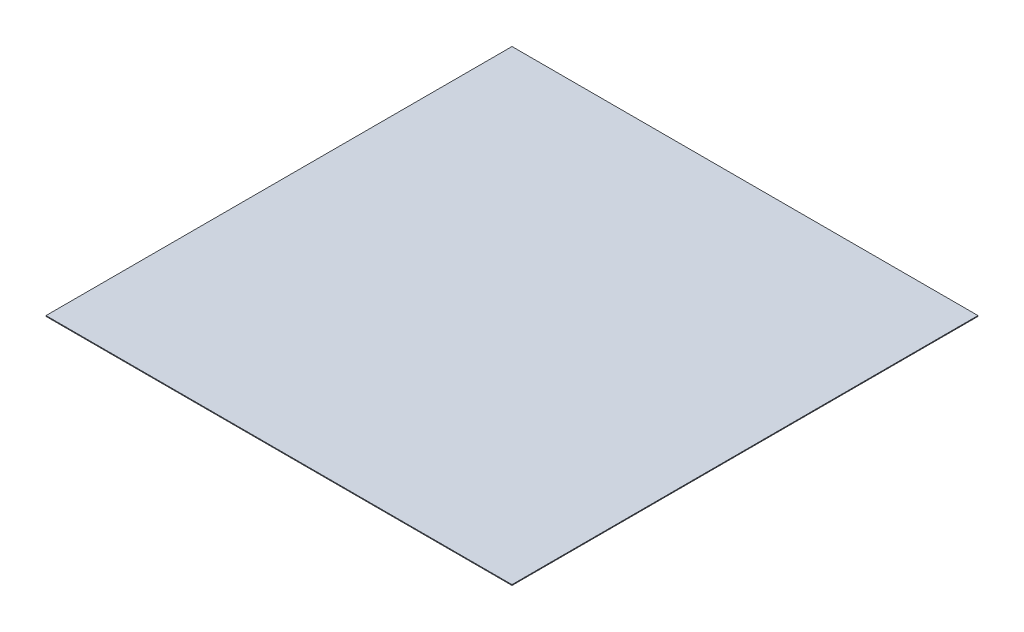
ISO-10303-21;
HEADER;
FILE_DESCRIPTION(('STEP AP214'),'2;1');
FILE_NAME('part.step','',(''),(''),'','','');
FILE_SCHEMA(('AUTOMOTIVE_DESIGN { 1 0 10303 214 1 1 1 1 }'));
ENDSEC;
DATA;
#1=APPLICATION_CONTEXT('core data for automotive mechanical design processes');
#2=APPLICATION_PROTOCOL_DEFINITION('international standard','automotive_design',2000,#1);
#3=PRODUCT_CONTEXT('',#1,'mechanical');
#4=PRODUCT('Part','Part','',(#3));
#5=PRODUCT_RELATED_PRODUCT_CATEGORY('part','',(#4));
#6=PRODUCT_DEFINITION_FORMATION('','',#4);
#7=PRODUCT_DEFINITION_CONTEXT('part definition',#1,'design');
#8=PRODUCT_DEFINITION('design','',#6,#7);
#9=PRODUCT_DEFINITION_SHAPE('','',#8);
#10=(LENGTH_UNIT() NAMED_UNIT(*) SI_UNIT(.MILLI.,.METRE.));
#11=(NAMED_UNIT(*) PLANE_ANGLE_UNIT() SI_UNIT($,.RADIAN.));
#12=(NAMED_UNIT(*) SI_UNIT($,.STERADIAN.) SOLID_ANGLE_UNIT());
#13=UNCERTAINTY_MEASURE_WITH_UNIT(LENGTH_MEASURE(1.E-05),#10,'distance_accuracy_value','');
#14=(GEOMETRIC_REPRESENTATION_CONTEXT(3) GLOBAL_UNCERTAINTY_ASSIGNED_CONTEXT((#13)) GLOBAL_UNIT_ASSIGNED_CONTEXT((#10,
#11,#12)) REPRESENTATION_CONTEXT('',''));
#15=CARTESIAN_POINT('',(0.,0.,0.));
#16=DIRECTION('',(0.,0.,1.));
#17=DIRECTION('',(1.,0.,0.));
#18=AXIS2_PLACEMENT_3D('',#15,#16,#17);
#19=CARTESIAN_POINT('',(-1.36424205265939E-11,50.8,-30480.));
#20=DIRECTION('',(1.,0.,0.));
#21=DIRECTION('',(0.,0.,-1.));
#22=AXIS2_PLACEMENT_3D('',#19,#20,#21);
#23=PLANE('',#22);
#24=DIRECTION('',(0.,0.,1.));
#25=VECTOR('',#24,1.);
#26=CARTESIAN_POINT('',(-1.36424205265939E-11,0.,-30480.));
#27=LINE('',#26,#25);
#28=CARTESIAN_POINT('',(-1.36424205265939E-11,0.,-30480.));
#29=VERTEX_POINT('',#28);
#30=CARTESIAN_POINT('',(0.,0.,0.));
#31=VERTEX_POINT('',#30);
#32=EDGE_CURVE('E96',#29,#31,#27,.T.);
#33=ORIENTED_EDGE('',*,*,#32,.T.);
#34=DIRECTION('',(0.,-1.,0.));
#35=VECTOR('',#34,1.);
#36=CARTESIAN_POINT('',(0.,50.8,0.));
#37=LINE('',#36,#35);
#38=CARTESIAN_POINT('',(0.,50.8,0.));
#39=VERTEX_POINT('',#38);
#40=EDGE_CURVE('E11',#39,#31,#37,.T.);
#41=ORIENTED_EDGE('',*,*,#40,.F.);
#42=DIRECTION('',(0.,0.,1.));
#43=VECTOR('',#42,1.);
#44=CARTESIAN_POINT('',(-1.36424205265939E-11,50.8,-30480.));
#45=LINE('',#44,#43);
#46=CARTESIAN_POINT('',(-1.36424205265939E-11,50.8,-30480.));
#47=VERTEX_POINT('',#46);
#48=EDGE_CURVE('E84',#47,#39,#45,.T.);
#49=ORIENTED_EDGE('',*,*,#48,.F.);
#50=DIRECTION('',(0.,-1.,0.));
#51=VECTOR('',#50,1.);
#52=CARTESIAN_POINT('',(-1.36424205265939E-11,50.8,-30480.));
#53=LINE('',#52,#51);
#54=EDGE_CURVE('E92',#47,#29,#53,.T.);
#55=ORIENTED_EDGE('',*,*,#54,.T.);
#56=EDGE_LOOP('',(#33,#41,#49,#55));
#57=FACE_BOUND('',#56,.T.);
#58=ADVANCED_FACE('F33',(#57),#23,.F.);
#59=CARTESIAN_POINT('',(0.,50.8,0.));
#60=DIRECTION('',(0.,0.,-1.));
#61=DIRECTION('',(-1.,0.,0.));
#62=AXIS2_PLACEMENT_3D('',#59,#60,#61);
#63=PLANE('',#62);
#64=DIRECTION('',(1.,0.,0.));
#65=VECTOR('',#64,1.);
#66=CARTESIAN_POINT('',(0.,0.,0.));
#67=LINE('',#66,#65);
#68=CARTESIAN_POINT('',(30480.,0.,-3.73272344380113E-12));
#69=VERTEX_POINT('',#68);
#70=EDGE_CURVE('E88',#31,#69,#67,.T.);
#71=ORIENTED_EDGE('',*,*,#70,.T.);
#72=DIRECTION('',(0.,-1.,0.));
#73=VECTOR('',#72,1.);
#74=CARTESIAN_POINT('',(30480.,50.8,-3.73272344380113E-12));
#75=LINE('',#74,#73);
#76=CARTESIAN_POINT('',(30480.,50.8,-3.73272344380113E-12));
#77=VERTEX_POINT('',#76);
#78=EDGE_CURVE('E41',#77,#69,#75,.T.);
#79=ORIENTED_EDGE('',*,*,#78,.F.);
#80=DIRECTION('',(1.,0.,0.));
#81=VECTOR('',#80,1.);
#82=CARTESIAN_POINT('',(0.,50.8,0.));
#83=LINE('',#82,#81);
#84=EDGE_CURVE('E79',#39,#77,#83,.T.);
#85=ORIENTED_EDGE('',*,*,#84,.F.);
#86=ORIENTED_EDGE('',*,*,#40,.T.);
#87=EDGE_LOOP('',(#71,#79,#85,#86));
#88=FACE_BOUND('',#87,.T.);
#89=ADVANCED_FACE('F87',(#88),#63,.F.);
#90=CARTESIAN_POINT('',(30480.,50.8,-3.73272344380113E-12));
#91=DIRECTION('',(-1.,0.,0.));
#92=DIRECTION('',(0.,0.,1.));
#93=AXIS2_PLACEMENT_3D('',#90,#91,#92);
#94=PLANE('',#93);
#95=DIRECTION('',(0.,0.,-1.));
#96=VECTOR('',#95,1.);
#97=CARTESIAN_POINT('',(30480.,0.,-3.73272344380113E-12));
#98=LINE('',#97,#96);
#99=CARTESIAN_POINT('',(30480.,0.,-30480.));
#100=VERTEX_POINT('',#99);
#101=EDGE_CURVE('E66',#69,#100,#98,.T.);
#102=ORIENTED_EDGE('',*,*,#101,.T.);
#103=DIRECTION('',(0.,-1.,0.));
#104=VECTOR('',#103,1.);
#105=CARTESIAN_POINT('',(30480.,50.8,-30480.));
#106=LINE('',#105,#104);
#107=CARTESIAN_POINT('',(30480.,50.8,-30480.));
#108=VERTEX_POINT('',#107);
#109=EDGE_CURVE('E89',#108,#100,#106,.T.);
#110=ORIENTED_EDGE('',*,*,#109,.F.);
#111=DIRECTION('',(0.,0.,-1.));
#112=VECTOR('',#111,1.);
#113=CARTESIAN_POINT('',(30480.,50.8,-3.73272344380113E-12));
#114=LINE('',#113,#112);
#115=EDGE_CURVE('E82',#77,#108,#114,.T.);
#116=ORIENTED_EDGE('',*,*,#115,.F.);
#117=ORIENTED_EDGE('',*,*,#78,.T.);
#118=EDGE_LOOP('',(#102,#110,#116,#117));
#119=FACE_BOUND('',#118,.T.);
#120=ADVANCED_FACE('F90',(#119),#94,.F.);
#121=CARTESIAN_POINT('',(30480.,50.8,-30480.));
#122=DIRECTION('',(0.,0.,1.));
#123=DIRECTION('',(1.,0.,0.));
#124=AXIS2_PLACEMENT_3D('',#121,#122,#123);
#125=PLANE('',#124);
#126=DIRECTION('',(-1.,0.,0.));
#127=VECTOR('',#126,1.);
#128=CARTESIAN_POINT('',(30480.,0.,-30480.));
#129=LINE('',#128,#127);
#130=EDGE_CURVE('E72',#100,#29,#129,.T.);
#131=ORIENTED_EDGE('',*,*,#130,.T.);
#132=ORIENTED_EDGE('',*,*,#54,.F.);
#133=DIRECTION('',(-1.,0.,0.));
#134=VECTOR('',#133,1.);
#135=CARTESIAN_POINT('',(30480.,50.8,-30480.));
#136=LINE('',#135,#134);
#137=EDGE_CURVE('E49',#108,#47,#136,.T.);
#138=ORIENTED_EDGE('',*,*,#137,.F.);
#139=ORIENTED_EDGE('',*,*,#109,.T.);
#140=EDGE_LOOP('',(#131,#132,#138,#139));
#141=FACE_BOUND('',#140,.T.);
#142=ADVANCED_FACE('F103',(#141),#125,.F.);
#143=CARTESIAN_POINT('',(0.,50.8,0.));
#144=DIRECTION('',(0.,1.,0.));
#145=DIRECTION('',(0.,0.,1.));
#146=AXIS2_PLACEMENT_3D('',#143,#144,#145);
#147=PLANE('',#146);
#148=ORIENTED_EDGE('',*,*,#48,.T.);
#149=ORIENTED_EDGE('',*,*,#84,.T.);
#150=ORIENTED_EDGE('',*,*,#115,.T.);
#151=ORIENTED_EDGE('',*,*,#137,.T.);
#152=EDGE_LOOP('',(#148,#149,#150,#151));
#153=FACE_BOUND('',#152,.T.);
#154=ADVANCED_FACE('F80',(#153),#147,.T.);
#155=CARTESIAN_POINT('',(0.,0.,0.));
#156=DIRECTION('',(0.,1.,0.));
#157=DIRECTION('',(0.,0.,1.));
#158=AXIS2_PLACEMENT_3D('',#155,#156,#157);
#159=PLANE('',#158);
#160=ORIENTED_EDGE('',*,*,#32,.F.);
#161=ORIENTED_EDGE('',*,*,#130,.F.);
#162=ORIENTED_EDGE('',*,*,#101,.F.);
#163=ORIENTED_EDGE('',*,*,#70,.F.);
#164=EDGE_LOOP('',(#160,#161,#162,#163));
#165=FACE_BOUND('',#164,.T.);
#166=ADVANCED_FACE('F106',(#165),#159,.F.);
#167=CLOSED_SHELL('',(#58,#89,#120,#142,#154,#166));
#168=MANIFOLD_SOLID_BREP('B2',#167);
#169=ADVANCED_BREP_SHAPE_REPRESENTATION('',(#18,#168),#14);
#170=SHAPE_DEFINITION_REPRESENTATION(#9,#169);
ENDSEC;
END-ISO-10303-21;
